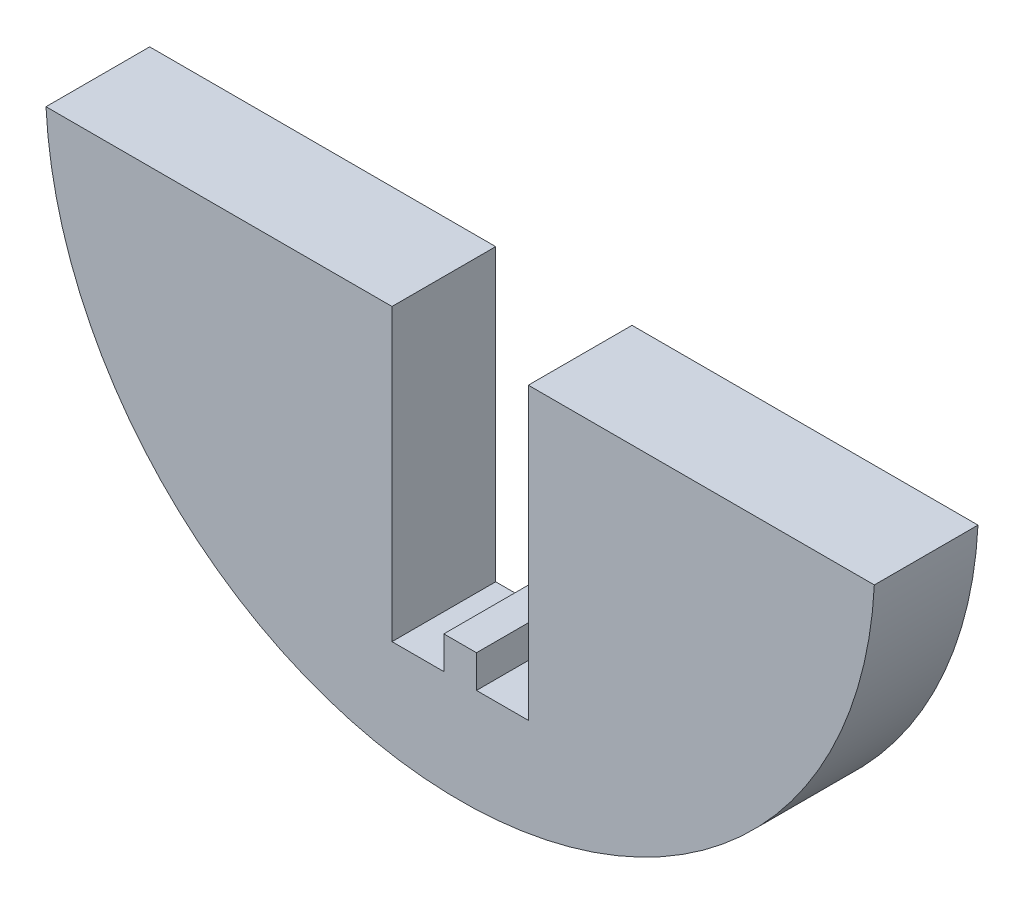
ISO-10303-21;
HEADER;
FILE_DESCRIPTION(('STEP AP214'),'2;1');
FILE_NAME('part.step','',(''),(''),'','','');
FILE_SCHEMA(('AUTOMOTIVE_DESIGN { 1 0 10303 214 1 1 1 1 }'));
ENDSEC;
DATA;
#1=APPLICATION_CONTEXT('core data for automotive mechanical design processes');
#2=APPLICATION_PROTOCOL_DEFINITION('international standard','automotive_design',2000,#1);
#3=PRODUCT_CONTEXT('',#1,'mechanical');
#4=PRODUCT('Part','Part','',(#3));
#5=PRODUCT_RELATED_PRODUCT_CATEGORY('part','',(#4));
#6=PRODUCT_DEFINITION_FORMATION('','',#4);
#7=PRODUCT_DEFINITION_CONTEXT('part definition',#1,'design');
#8=PRODUCT_DEFINITION('design','',#6,#7);
#9=PRODUCT_DEFINITION_SHAPE('','',#8);
#10=(LENGTH_UNIT() NAMED_UNIT(*) SI_UNIT(.MILLI.,.METRE.));
#11=(NAMED_UNIT(*) PLANE_ANGLE_UNIT() SI_UNIT($,.RADIAN.));
#12=(NAMED_UNIT(*) SI_UNIT($,.STERADIAN.) SOLID_ANGLE_UNIT());
#13=UNCERTAINTY_MEASURE_WITH_UNIT(LENGTH_MEASURE(1.E-05),#10,'distance_accuracy_value','');
#14=(GEOMETRIC_REPRESENTATION_CONTEXT(3) GLOBAL_UNCERTAINTY_ASSIGNED_CONTEXT((#13)) GLOBAL_UNIT_ASSIGNED_CONTEXT((#10,
#11,#12)) REPRESENTATION_CONTEXT('',''));
#15=CARTESIAN_POINT('',(0.,0.,0.));
#16=DIRECTION('',(0.,0.,1.));
#17=DIRECTION('',(1.,0.,0.));
#18=AXIS2_PLACEMENT_3D('',#15,#16,#17);
#19=CARTESIAN_POINT('',(0.,0.,6.34999999999999));
#20=DIRECTION('',(0.,0.,-1.));
#21=DIRECTION('',(-1.,0.,0.));
#22=AXIS2_PLACEMENT_3D('',#19,#20,#21);
#23=PLANE('',#22);
#24=CARTESIAN_POINT('',(0.,0.,6.35));
#25=DIRECTION('',(0.,0.,-1.));
#26=DIRECTION('',(1.,0.,0.));
#27=AXIS2_PLACEMENT_3D('',#24,#25,#26);
#28=CIRCLE('',#27,25.4);
#29=CARTESIAN_POINT('',(25.3682301314065,-1.27000000000001,6.35));
#30=VERTEX_POINT('',#29);
#31=CARTESIAN_POINT('',(-25.3682301314065,-1.27,6.35));
#32=VERTEX_POINT('',#31);
#33=EDGE_CURVE('E157',#30,#32,#28,.T.);
#34=ORIENTED_EDGE('',*,*,#33,.F.);
#35=DIRECTION('',(1.,0.,0.));
#36=VECTOR('',#35,1.);
#37=CARTESIAN_POINT('',(4.174999999996,-1.27000000000001,6.34999999999999));
#38=LINE('',#37,#36);
#39=CARTESIAN_POINT('',(4.174999999996,-1.27000000000001,6.34999999999999));
#40=VERTEX_POINT('',#39);
#41=EDGE_CURVE('E166',#40,#30,#38,.T.);
#42=ORIENTED_EDGE('',*,*,#41,.F.);
#43=DIRECTION('',(0.,1.,0.));
#44=VECTOR('',#43,1.);
#45=CARTESIAN_POINT('',(4.174999999996,-19.05,6.34999999999999));
#46=LINE('',#45,#44);
#47=CARTESIAN_POINT('',(4.174999999996,-19.05,6.34999999999999));
#48=VERTEX_POINT('',#47);
#49=EDGE_CURVE('E173',#48,#40,#46,.T.);
#50=ORIENTED_EDGE('',*,*,#49,.F.);
#51=DIRECTION('',(1.,0.,0.));
#52=VECTOR('',#51,1.);
#53=CARTESIAN_POINT('',(4.174999999996,-19.05,6.34999999999999));
#54=LINE('',#53,#52);
#55=CARTESIAN_POINT('',(0.999999999996001,-19.05,6.34999999999999));
#56=VERTEX_POINT('',#55);
#57=EDGE_CURVE('E181',#56,#48,#54,.T.);
#58=ORIENTED_EDGE('',*,*,#57,.F.);
#59=DIRECTION('',(0.,-1.,0.));
#60=VECTOR('',#59,1.);
#61=CARTESIAN_POINT('',(0.999999999996001,-19.05,6.34999999999999));
#62=LINE('',#61,#60);
#63=CARTESIAN_POINT('',(0.999999999996001,-17.05,6.34999999999999));
#64=VERTEX_POINT('',#63);
#65=EDGE_CURVE('E306',#64,#56,#62,.T.);
#66=ORIENTED_EDGE('',*,*,#65,.F.);
#67=DIRECTION('',(1.,0.,0.));
#68=VECTOR('',#67,1.);
#69=CARTESIAN_POINT('',(0.999999999996001,-17.05,6.34999999999999));
#70=LINE('',#69,#68);
#71=CARTESIAN_POINT('',(-1.000000000004,-17.05,6.34999999999999));
#72=VERTEX_POINT('',#71);
#73=EDGE_CURVE('E289',#72,#64,#70,.T.);
#74=ORIENTED_EDGE('',*,*,#73,.F.);
#75=DIRECTION('',(0.,1.,0.));
#76=VECTOR('',#75,1.);
#77=CARTESIAN_POINT('',(-1.000000000004,-17.05,6.34999999999999));
#78=LINE('',#77,#76);
#79=CARTESIAN_POINT('',(-1.000000000004,-19.05,6.34999999999999));
#80=VERTEX_POINT('',#79);
#81=EDGE_CURVE('E272',#80,#72,#78,.T.);
#82=ORIENTED_EDGE('',*,*,#81,.F.);
#83=DIRECTION('',(1.,0.,0.));
#84=VECTOR('',#83,1.);
#85=CARTESIAN_POINT('',(-1.000000000004,-19.05,6.34999999999999));
#86=LINE('',#85,#84);
#87=CARTESIAN_POINT('',(-4.175000000004,-19.05,6.34999999999999));
#88=VERTEX_POINT('',#87);
#89=EDGE_CURVE('E244',#88,#80,#86,.T.);
#90=ORIENTED_EDGE('',*,*,#89,.F.);
#91=DIRECTION('',(0.,-1.,0.));
#92=VECTOR('',#91,1.);
#93=CARTESIAN_POINT('',(-4.175000000004,-1.27000000000001,6.34999999999999));
#94=LINE('',#93,#92);
#95=CARTESIAN_POINT('',(-4.175000000004,-1.27000000000001,6.34999999999999));
#96=VERTEX_POINT('',#95);
#97=EDGE_CURVE('E237',#96,#88,#94,.T.);
#98=ORIENTED_EDGE('',*,*,#97,.F.);
#99=DIRECTION('',(1.,0.,0.));
#100=VECTOR('',#99,1.);
#101=CARTESIAN_POINT('',(-25.3682301314065,-1.27000000000001,6.34999999999999));
#102=LINE('',#101,#100);
#103=EDGE_CURVE('E136',#32,#96,#102,.T.);
#104=ORIENTED_EDGE('',*,*,#103,.F.);
#105=EDGE_LOOP('',(#34,#42,#50,#58,#66,#74,#82,#90,#98,#104));
#106=FACE_BOUND('',#105,.T.);
#107=ADVANCED_FACE('F126',(#106),#23,.F.);
#108=CARTESIAN_POINT('',(0.,0.,0.));
#109=DIRECTION('',(0.,0.,-1.));
#110=DIRECTION('',(-1.,0.,0.));
#111=AXIS2_PLACEMENT_3D('',#108,#109,#110);
#112=PLANE('',#111);
#113=CARTESIAN_POINT('',(0.,0.,0.));
#114=DIRECTION('',(0.,0.,-1.));
#115=DIRECTION('',(1.,0.,0.));
#116=AXIS2_PLACEMENT_3D('',#113,#114,#115);
#117=CIRCLE('',#116,25.4);
#118=CARTESIAN_POINT('',(25.3682301314065,-1.27000000000001,0.));
#119=VERTEX_POINT('',#118);
#120=CARTESIAN_POINT('',(-25.3682301314065,-1.27,0.));
#121=VERTEX_POINT('',#120);
#122=EDGE_CURVE('E358',#119,#121,#117,.T.);
#123=ORIENTED_EDGE('',*,*,#122,.T.);
#124=DIRECTION('',(1.,0.,0.));
#125=VECTOR('',#124,1.);
#126=CARTESIAN_POINT('',(-25.3682301314065,-1.27000000000001,0.));
#127=LINE('',#126,#125);
#128=CARTESIAN_POINT('',(-4.175000000004,-1.27000000000001,0.));
#129=VERTEX_POINT('',#128);
#130=EDGE_CURVE('E12',#121,#129,#127,.T.);
#131=ORIENTED_EDGE('',*,*,#130,.T.);
#132=DIRECTION('',(0.,-1.,0.));
#133=VECTOR('',#132,1.);
#134=CARTESIAN_POINT('',(-4.175000000004,-1.27000000000001,0.));
#135=LINE('',#134,#133);
#136=CARTESIAN_POINT('',(-4.175000000004,-19.05,0.));
#137=VERTEX_POINT('',#136);
#138=EDGE_CURVE('E232',#129,#137,#135,.T.);
#139=ORIENTED_EDGE('',*,*,#138,.T.);
#140=DIRECTION('',(1.,0.,0.));
#141=VECTOR('',#140,1.);
#142=CARTESIAN_POINT('',(-1.000000000004,-19.05,0.));
#143=LINE('',#142,#141);
#144=CARTESIAN_POINT('',(-1.000000000004,-19.05,0.));
#145=VERTEX_POINT('',#144);
#146=EDGE_CURVE('E246',#137,#145,#143,.T.);
#147=ORIENTED_EDGE('',*,*,#146,.T.);
#148=DIRECTION('',(0.,1.,0.));
#149=VECTOR('',#148,1.);
#150=CARTESIAN_POINT('',(-1.000000000004,-17.05,0.));
#151=LINE('',#150,#149);
#152=CARTESIAN_POINT('',(-1.000000000004,-17.05,0.));
#153=VERTEX_POINT('',#152);
#154=EDGE_CURVE('E265',#145,#153,#151,.T.);
#155=ORIENTED_EDGE('',*,*,#154,.T.);
#156=DIRECTION('',(1.,0.,0.));
#157=VECTOR('',#156,1.);
#158=CARTESIAN_POINT('',(0.999999999996001,-17.05,0.));
#159=LINE('',#158,#157);
#160=CARTESIAN_POINT('',(0.999999999996001,-17.05,0.));
#161=VERTEX_POINT('',#160);
#162=EDGE_CURVE('E282',#153,#161,#159,.T.);
#163=ORIENTED_EDGE('',*,*,#162,.T.);
#164=DIRECTION('',(0.,-1.,0.));
#165=VECTOR('',#164,1.);
#166=CARTESIAN_POINT('',(0.999999999996001,-19.05,0.));
#167=LINE('',#166,#165);
#168=CARTESIAN_POINT('',(0.999999999996001,-19.05,0.));
#169=VERTEX_POINT('',#168);
#170=EDGE_CURVE('E299',#161,#169,#167,.T.);
#171=ORIENTED_EDGE('',*,*,#170,.T.);
#172=DIRECTION('',(1.,0.,0.));
#173=VECTOR('',#172,1.);
#174=CARTESIAN_POINT('',(4.174999999996,-19.05,0.));
#175=LINE('',#174,#173);
#176=CARTESIAN_POINT('',(4.174999999996,-19.05,0.));
#177=VERTEX_POINT('',#176);
#178=EDGE_CURVE('E198',#169,#177,#175,.T.);
#179=ORIENTED_EDGE('',*,*,#178,.T.);
#180=DIRECTION('',(0.,1.,0.));
#181=VECTOR('',#180,1.);
#182=CARTESIAN_POINT('',(4.174999999996,-19.05,0.));
#183=LINE('',#182,#181);
#184=CARTESIAN_POINT('',(4.174999999996,-1.27000000000001,0.));
#185=VERTEX_POINT('',#184);
#186=EDGE_CURVE('E193',#177,#185,#183,.T.);
#187=ORIENTED_EDGE('',*,*,#186,.T.);
#188=DIRECTION('',(1.,0.,0.));
#189=VECTOR('',#188,1.);
#190=CARTESIAN_POINT('',(4.174999999996,-1.27000000000001,0.));
#191=LINE('',#190,#189);
#192=EDGE_CURVE('E189',#185,#119,#191,.T.);
#193=ORIENTED_EDGE('',*,*,#192,.T.);
#194=EDGE_LOOP('',(#123,#131,#139,#147,#155,#163,#171,#179,#187,#193));
#195=FACE_BOUND('',#194,.T.);
#196=ADVANCED_FACE('F381',(#195),#112,.T.);
#197=CARTESIAN_POINT('',(0.,0.,0.));
#198=DIRECTION('',(0.,0.,1.));
#199=DIRECTION('',(1.,0.,0.));
#200=AXIS2_PLACEMENT_3D('',#197,#198,#199);
#201=CYLINDRICAL_SURFACE('',#200,25.4);
#202=ORIENTED_EDGE('',*,*,#33,.T.);
#203=DIRECTION('',(0.,0.,1.));
#204=VECTOR('',#203,1.);
#205=CARTESIAN_POINT('',(-25.3682301314065,-1.27,0.));
#206=LINE('',#205,#204);
#207=EDGE_CURVE('E228',#121,#32,#206,.T.);
#208=ORIENTED_EDGE('',*,*,#207,.F.);
#209=ORIENTED_EDGE('',*,*,#122,.F.);
#210=DIRECTION('',(0.,0.,1.));
#211=VECTOR('',#210,1.);
#212=CARTESIAN_POINT('',(25.3682301314065,-1.27000000000001,0.));
#213=LINE('',#212,#211);
#214=EDGE_CURVE('E356',#119,#30,#213,.T.);
#215=ORIENTED_EDGE('',*,*,#214,.T.);
#216=EDGE_LOOP('',(#202,#208,#209,#215));
#217=FACE_BOUND('',#216,.T.);
#218=ADVANCED_FACE('F382',(#217),#201,.T.);
#219=CARTESIAN_POINT('',(4.174999999996,-1.27000000000001,0.));
#220=DIRECTION('',(0.,-1.,0.));
#221=DIRECTION('',(1.,0.,0.));
#222=AXIS2_PLACEMENT_3D('',#219,#220,#221);
#223=PLANE('',#222);
#224=ORIENTED_EDGE('',*,*,#41,.T.);
#225=ORIENTED_EDGE('',*,*,#214,.F.);
#226=ORIENTED_EDGE('',*,*,#192,.F.);
#227=DIRECTION('',(0.,0.,1.));
#228=VECTOR('',#227,1.);
#229=CARTESIAN_POINT('',(4.174999999996,-1.27000000000001,0.));
#230=LINE('',#229,#228);
#231=EDGE_CURVE('E344',#185,#40,#230,.T.);
#232=ORIENTED_EDGE('',*,*,#231,.T.);
#233=EDGE_LOOP('',(#224,#225,#226,#232));
#234=FACE_BOUND('',#233,.T.);
#235=ADVANCED_FACE('F383',(#234),#223,.F.);
#236=CARTESIAN_POINT('',(4.174999999996,-19.05,0.));
#237=DIRECTION('',(1.,0.,0.));
#238=DIRECTION('',(0.,0.,-1.));
#239=AXIS2_PLACEMENT_3D('',#236,#237,#238);
#240=PLANE('',#239);
#241=ORIENTED_EDGE('',*,*,#49,.T.);
#242=ORIENTED_EDGE('',*,*,#231,.F.);
#243=ORIENTED_EDGE('',*,*,#186,.F.);
#244=DIRECTION('',(0.,0.,1.));
#245=VECTOR('',#244,1.);
#246=CARTESIAN_POINT('',(4.174999999996,-19.05,0.));
#247=LINE('',#246,#245);
#248=EDGE_CURVE('E331',#177,#48,#247,.T.);
#249=ORIENTED_EDGE('',*,*,#248,.T.);
#250=EDGE_LOOP('',(#241,#242,#243,#249));
#251=FACE_BOUND('',#250,.T.);
#252=ADVANCED_FACE('F385',(#251),#240,.F.);
#253=CARTESIAN_POINT('',(4.174999999996,-19.05,0.));
#254=DIRECTION('',(0.,-1.,0.));
#255=DIRECTION('',(0.,0.,-1.));
#256=AXIS2_PLACEMENT_3D('',#253,#254,#255);
#257=PLANE('',#256);
#258=ORIENTED_EDGE('',*,*,#57,.T.);
#259=ORIENTED_EDGE('',*,*,#248,.F.);
#260=ORIENTED_EDGE('',*,*,#178,.F.);
#261=DIRECTION('',(0.,0.,1.));
#262=VECTOR('',#261,1.);
#263=CARTESIAN_POINT('',(0.999999999996001,-19.05,0.));
#264=LINE('',#263,#262);
#265=EDGE_CURVE('E318',#169,#56,#264,.T.);
#266=ORIENTED_EDGE('',*,*,#265,.T.);
#267=EDGE_LOOP('',(#258,#259,#260,#266));
#268=FACE_BOUND('',#267,.T.);
#269=ADVANCED_FACE('F391',(#268),#257,.F.);
#270=CARTESIAN_POINT('',(0.999999999996001,-19.05,0.));
#271=DIRECTION('',(-1.,0.,0.));
#272=DIRECTION('',(0.,0.,1.));
#273=AXIS2_PLACEMENT_3D('',#270,#271,#272);
#274=PLANE('',#273);
#275=ORIENTED_EDGE('',*,*,#65,.T.);
#276=ORIENTED_EDGE('',*,*,#265,.F.);
#277=ORIENTED_EDGE('',*,*,#170,.F.);
#278=DIRECTION('',(0.,0.,1.));
#279=VECTOR('',#278,1.);
#280=CARTESIAN_POINT('',(0.999999999996001,-17.05,0.));
#281=LINE('',#280,#279);
#282=EDGE_CURVE('E302',#161,#64,#281,.T.);
#283=ORIENTED_EDGE('',*,*,#282,.T.);
#284=EDGE_LOOP('',(#275,#276,#277,#283));
#285=FACE_BOUND('',#284,.T.);
#286=ADVANCED_FACE('F443',(#285),#274,.F.);
#287=CARTESIAN_POINT('',(0.999999999996001,-17.05,0.));
#288=DIRECTION('',(0.,-1.,0.));
#289=DIRECTION('',(0.,0.,-1.));
#290=AXIS2_PLACEMENT_3D('',#287,#288,#289);
#291=PLANE('',#290);
#292=ORIENTED_EDGE('',*,*,#73,.T.);
#293=ORIENTED_EDGE('',*,*,#282,.F.);
#294=ORIENTED_EDGE('',*,*,#162,.F.);
#295=DIRECTION('',(0.,0.,1.));
#296=VECTOR('',#295,1.);
#297=CARTESIAN_POINT('',(-1.000000000004,-17.05,0.));
#298=LINE('',#297,#296);
#299=EDGE_CURVE('E285',#153,#72,#298,.T.);
#300=ORIENTED_EDGE('',*,*,#299,.T.);
#301=EDGE_LOOP('',(#292,#293,#294,#300));
#302=FACE_BOUND('',#301,.T.);
#303=ADVANCED_FACE('F452',(#302),#291,.F.);
#304=CARTESIAN_POINT('',(-1.000000000004,-17.05,0.));
#305=DIRECTION('',(1.,0.,0.));
#306=DIRECTION('',(0.,0.,-1.));
#307=AXIS2_PLACEMENT_3D('',#304,#305,#306);
#308=PLANE('',#307);
#309=ORIENTED_EDGE('',*,*,#81,.T.);
#310=ORIENTED_EDGE('',*,*,#299,.F.);
#311=ORIENTED_EDGE('',*,*,#154,.F.);
#312=DIRECTION('',(0.,0.,1.));
#313=VECTOR('',#312,1.);
#314=CARTESIAN_POINT('',(-1.000000000004,-19.05,0.));
#315=LINE('',#314,#313);
#316=EDGE_CURVE('E268',#145,#80,#315,.T.);
#317=ORIENTED_EDGE('',*,*,#316,.T.);
#318=EDGE_LOOP('',(#309,#310,#311,#317));
#319=FACE_BOUND('',#318,.T.);
#320=ADVANCED_FACE('F462',(#319),#308,.F.);
#321=CARTESIAN_POINT('',(-1.000000000004,-19.05,0.));
#322=DIRECTION('',(0.,-1.,0.));
#323=DIRECTION('',(0.,0.,-1.));
#324=AXIS2_PLACEMENT_3D('',#321,#322,#323);
#325=PLANE('',#324);
#326=ORIENTED_EDGE('',*,*,#89,.T.);
#327=ORIENTED_EDGE('',*,*,#316,.F.);
#328=ORIENTED_EDGE('',*,*,#146,.F.);
#329=DIRECTION('',(0.,0.,1.));
#330=VECTOR('',#329,1.);
#331=CARTESIAN_POINT('',(-4.175000000004,-19.05,0.));
#332=LINE('',#331,#330);
#333=EDGE_CURVE('E250',#137,#88,#332,.T.);
#334=ORIENTED_EDGE('',*,*,#333,.T.);
#335=EDGE_LOOP('',(#326,#327,#328,#334));
#336=FACE_BOUND('',#335,.T.);
#337=ADVANCED_FACE('F399',(#336),#325,.F.);
#338=CARTESIAN_POINT('',(-4.175000000004,-1.27000000000001,0.));
#339=DIRECTION('',(-1.,0.,0.));
#340=DIRECTION('',(0.,-1.,0.));
#341=AXIS2_PLACEMENT_3D('',#338,#339,#340);
#342=PLANE('',#341);
#343=ORIENTED_EDGE('',*,*,#97,.T.);
#344=ORIENTED_EDGE('',*,*,#333,.F.);
#345=ORIENTED_EDGE('',*,*,#138,.F.);
#346=DIRECTION('',(0.,0.,1.));
#347=VECTOR('',#346,1.);
#348=CARTESIAN_POINT('',(-4.175000000004,-1.27000000000001,0.));
#349=LINE('',#348,#347);
#350=EDGE_CURVE('E227',#129,#96,#349,.T.);
#351=ORIENTED_EDGE('',*,*,#350,.T.);
#352=EDGE_LOOP('',(#343,#344,#345,#351));
#353=FACE_BOUND('',#352,.T.);
#354=ADVANCED_FACE('F235',(#353),#342,.F.);
#355=CARTESIAN_POINT('',(-25.3682301314065,-1.27000000000001,0.));
#356=DIRECTION('',(0.,-1.,0.));
#357=DIRECTION('',(0.,0.,-1.));
#358=AXIS2_PLACEMENT_3D('',#355,#356,#357);
#359=PLANE('',#358);
#360=ORIENTED_EDGE('',*,*,#103,.T.);
#361=ORIENTED_EDGE('',*,*,#350,.F.);
#362=ORIENTED_EDGE('',*,*,#130,.F.);
#363=ORIENTED_EDGE('',*,*,#207,.T.);
#364=EDGE_LOOP('',(#360,#361,#362,#363));
#365=FACE_BOUND('',#364,.T.);
#366=ADVANCED_FACE('F226',(#365),#359,.F.);
#367=CLOSED_SHELL('',(#107,#196,#218,#235,#252,#269,#286,#303,#320,#337,#354,#366));
#368=MANIFOLD_SOLID_BREP('B2',#367);
#369=ADVANCED_BREP_SHAPE_REPRESENTATION('',(#18,#368),#14);
#370=SHAPE_DEFINITION_REPRESENTATION(#9,#369);
ENDSEC;
END-ISO-10303-21;
